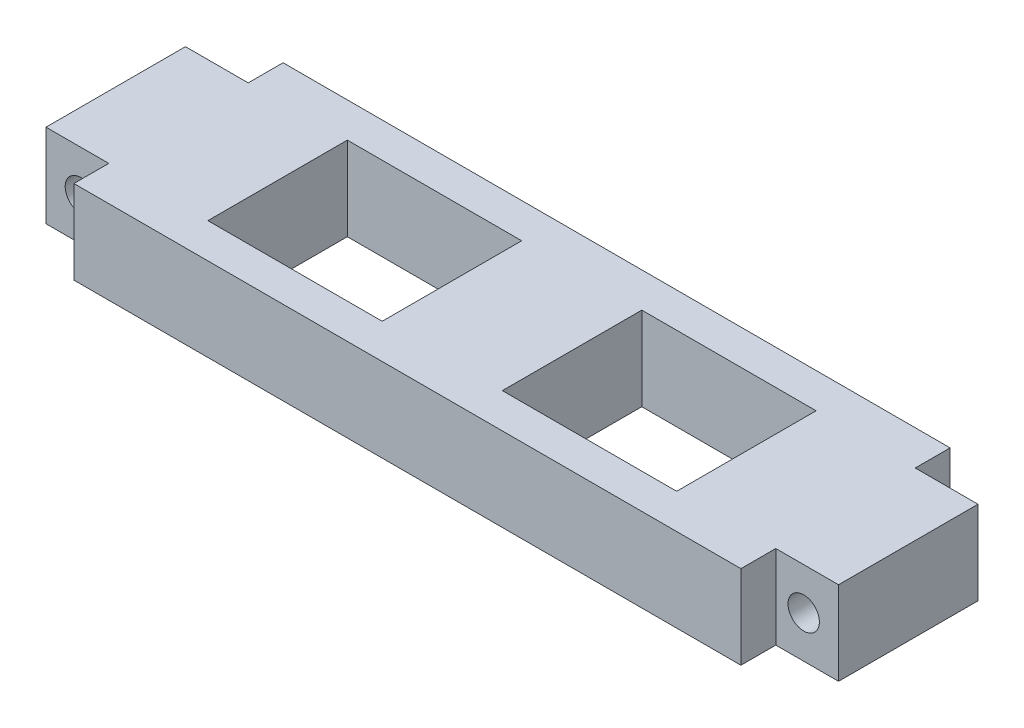
ISO-10303-21;
HEADER;
FILE_DESCRIPTION(('STEP AP214'),'2;1');
FILE_NAME('part.step','',(''),(''),'','','');
FILE_SCHEMA(('AUTOMOTIVE_DESIGN { 1 0 10303 214 1 1 1 1 }'));
ENDSEC;
DATA;
#1=APPLICATION_CONTEXT('core data for automotive mechanical design processes');
#2=APPLICATION_PROTOCOL_DEFINITION('international standard','automotive_design',2000,#1);
#3=PRODUCT_CONTEXT('',#1,'mechanical');
#4=PRODUCT('Part','Part','',(#3));
#5=PRODUCT_RELATED_PRODUCT_CATEGORY('part','',(#4));
#6=PRODUCT_DEFINITION_FORMATION('','',#4);
#7=PRODUCT_DEFINITION_CONTEXT('part definition',#1,'design');
#8=PRODUCT_DEFINITION('design','',#6,#7);
#9=PRODUCT_DEFINITION_SHAPE('','',#8);
#10=(LENGTH_UNIT() NAMED_UNIT(*) SI_UNIT(.MILLI.,.METRE.));
#11=(NAMED_UNIT(*) PLANE_ANGLE_UNIT() SI_UNIT($,.RADIAN.));
#12=(NAMED_UNIT(*) SI_UNIT($,.STERADIAN.) SOLID_ANGLE_UNIT());
#13=UNCERTAINTY_MEASURE_WITH_UNIT(LENGTH_MEASURE(1.E-05),#10,'distance_accuracy_value','');
#14=(GEOMETRIC_REPRESENTATION_CONTEXT(3) GLOBAL_UNCERTAINTY_ASSIGNED_CONTEXT((#13)) GLOBAL_UNIT_ASSIGNED_CONTEXT((#10,
#11,#12)) REPRESENTATION_CONTEXT('',''));
#15=CARTESIAN_POINT('',(0.,0.,0.));
#16=DIRECTION('',(0.,0.,1.));
#17=DIRECTION('',(1.,0.,0.));
#18=AXIS2_PLACEMENT_3D('',#15,#16,#17);
#19=CARTESIAN_POINT('',(0.,12.,0.));
#20=DIRECTION('',(0.,1.,0.));
#21=DIRECTION('',(0.,0.,1.));
#22=AXIS2_PLACEMENT_3D('',#19,#20,#21);
#23=PLANE('',#22);
#24=DIRECTION('',(0.,0.,-1.));
#25=VECTOR('',#24,1.);
#26=CARTESIAN_POINT('',(47.833335,12.,-15.));
#27=LINE('',#26,#25);
#28=CARTESIAN_POINT('',(47.833335,12.,-10.));
#29=VERTEX_POINT('',#28);
#30=CARTESIAN_POINT('',(47.833335,12.,-15.));
#31=VERTEX_POINT('',#30);
#32=EDGE_CURVE('E239',#29,#31,#27,.T.);
#33=ORIENTED_EDGE('',*,*,#32,.T.);
#34=DIRECTION('',(-1.,0.,0.));
#35=VECTOR('',#34,1.);
#36=CARTESIAN_POINT('',(-47.833335,12.,-15.));
#37=LINE('',#36,#35);
#38=CARTESIAN_POINT('',(-47.833335,12.,-15.));
#39=VERTEX_POINT('',#38);
#40=EDGE_CURVE('E242',#31,#39,#37,.T.);
#41=ORIENTED_EDGE('',*,*,#40,.T.);
#42=DIRECTION('',(0.,0.,1.));
#43=VECTOR('',#42,1.);
#44=CARTESIAN_POINT('',(-47.833335,12.,-15.));
#45=LINE('',#44,#43);
#46=CARTESIAN_POINT('',(-47.833335,12.,-10.));
#47=VERTEX_POINT('',#46);
#48=EDGE_CURVE('E245',#39,#47,#45,.T.);
#49=ORIENTED_EDGE('',*,*,#48,.T.);
#50=DIRECTION('',(-1.,0.,0.));
#51=VECTOR('',#50,1.);
#52=CARTESIAN_POINT('',(-47.833335,12.,-10.));
#53=LINE('',#52,#51);
#54=CARTESIAN_POINT('',(-56.833335,12.,-10.));
#55=VERTEX_POINT('',#54);
#56=EDGE_CURVE('E247',#47,#55,#53,.T.);
#57=ORIENTED_EDGE('',*,*,#56,.T.);
#58=DIRECTION('',(0.,0.,1.));
#59=VECTOR('',#58,1.);
#60=CARTESIAN_POINT('',(-56.833335,12.,-10.));
#61=LINE('',#60,#59);
#62=CARTESIAN_POINT('',(-56.833335,12.,10.));
#63=VERTEX_POINT('',#62);
#64=EDGE_CURVE('E249',#55,#63,#61,.T.);
#65=ORIENTED_EDGE('',*,*,#64,.T.);
#66=DIRECTION('',(1.,0.,0.));
#67=VECTOR('',#66,1.);
#68=CARTESIAN_POINT('',(-56.833335,12.,10.));
#69=LINE('',#68,#67);
#70=CARTESIAN_POINT('',(-47.833335,12.,10.));
#71=VERTEX_POINT('',#70);
#72=EDGE_CURVE('E251',#63,#71,#69,.T.);
#73=ORIENTED_EDGE('',*,*,#72,.T.);
#74=DIRECTION('',(0.,0.,1.));
#75=VECTOR('',#74,1.);
#76=CARTESIAN_POINT('',(-47.833335,12.,10.));
#77=LINE('',#76,#75);
#78=CARTESIAN_POINT('',(-47.833335,12.,15.));
#79=VERTEX_POINT('',#78);
#80=EDGE_CURVE('E253',#71,#79,#77,.T.);
#81=ORIENTED_EDGE('',*,*,#80,.T.);
#82=DIRECTION('',(1.,0.,0.));
#83=VECTOR('',#82,1.);
#84=CARTESIAN_POINT('',(-47.833335,12.,15.));
#85=LINE('',#84,#83);
#86=CARTESIAN_POINT('',(47.833335,12.,15.));
#87=VERTEX_POINT('',#86);
#88=EDGE_CURVE('E255',#79,#87,#85,.T.);
#89=ORIENTED_EDGE('',*,*,#88,.T.);
#90=DIRECTION('',(0.,0.,-1.));
#91=VECTOR('',#90,1.);
#92=CARTESIAN_POINT('',(47.833335,12.,10.));
#93=LINE('',#92,#91);
#94=CARTESIAN_POINT('',(47.833335,12.,10.));
#95=VERTEX_POINT('',#94);
#96=EDGE_CURVE('E257',#87,#95,#93,.T.);
#97=ORIENTED_EDGE('',*,*,#96,.T.);
#98=DIRECTION('',(1.,0.,0.));
#99=VECTOR('',#98,1.);
#100=CARTESIAN_POINT('',(56.833335,12.,10.));
#101=LINE('',#100,#99);
#102=CARTESIAN_POINT('',(56.833335,12.,10.));
#103=VERTEX_POINT('',#102);
#104=EDGE_CURVE('E259',#95,#103,#101,.T.);
#105=ORIENTED_EDGE('',*,*,#104,.T.);
#106=DIRECTION('',(0.,0.,-1.));
#107=VECTOR('',#106,1.);
#108=CARTESIAN_POINT('',(56.833335,12.,-10.));
#109=LINE('',#108,#107);
#110=CARTESIAN_POINT('',(56.833335,12.,-10.));
#111=VERTEX_POINT('',#110);
#112=EDGE_CURVE('E261',#103,#111,#109,.T.);
#113=ORIENTED_EDGE('',*,*,#112,.T.);
#114=DIRECTION('',(-1.,0.,0.));
#115=VECTOR('',#114,1.);
#116=CARTESIAN_POINT('',(47.833335,12.,-10.));
#117=LINE('',#116,#115);
#118=EDGE_CURVE('E263',#111,#29,#117,.T.);
#119=ORIENTED_EDGE('',*,*,#118,.T.);
#120=EDGE_LOOP('',(#33,#41,#49,#57,#65,#73,#81,#89,#97,#105,#113,#119));
#121=FACE_BOUND('',#120,.T.);
#122=DIRECTION('',(1.,0.,0.));
#123=VECTOR('',#122,1.);
#124=CARTESIAN_POINT('',(-33.6152893126254,12.,10.));
#125=LINE('',#124,#123);
#126=CARTESIAN_POINT('',(-33.6152893126254,12.,10.));
#127=VERTEX_POINT('',#126);
#128=CARTESIAN_POINT('',(-8.61528931262541,12.,10.));
#129=VERTEX_POINT('',#128);
#130=EDGE_CURVE('E210',#127,#129,#125,.T.);
#131=ORIENTED_EDGE('',*,*,#130,.F.);
#132=DIRECTION('',(0.,0.,1.));
#133=VECTOR('',#132,1.);
#134=CARTESIAN_POINT('',(-33.6152893126254,12.,-10.));
#135=LINE('',#134,#133);
#136=CARTESIAN_POINT('',(-33.6152893126254,12.,-10.));
#137=VERTEX_POINT('',#136);
#138=EDGE_CURVE('E208',#137,#127,#135,.T.);
#139=ORIENTED_EDGE('',*,*,#138,.F.);
#140=DIRECTION('',(-1.,0.,0.));
#141=VECTOR('',#140,1.);
#142=CARTESIAN_POINT('',(-33.6152893126254,12.,-10.));
#143=LINE('',#142,#141);
#144=CARTESIAN_POINT('',(-8.61528931262541,12.,-10.));
#145=VERTEX_POINT('',#144);
#146=EDGE_CURVE('E216',#145,#137,#143,.T.);
#147=ORIENTED_EDGE('',*,*,#146,.F.);
#148=DIRECTION('',(0.,0.,-1.));
#149=VECTOR('',#148,1.);
#150=CARTESIAN_POINT('',(-8.61528931262541,12.,-10.));
#151=LINE('',#150,#149);
#152=EDGE_CURVE('E213',#129,#145,#151,.T.);
#153=ORIENTED_EDGE('',*,*,#152,.F.);
#154=EDGE_LOOP('',(#131,#139,#147,#153));
#155=FACE_BOUND('',#154,.T.);
#156=DIRECTION('',(1.,0.,0.));
#157=VECTOR('',#156,1.);
#158=CARTESIAN_POINT('',(8.61528931262542,12.,10.));
#159=LINE('',#158,#157);
#160=CARTESIAN_POINT('',(8.61528931262542,12.,10.));
#161=VERTEX_POINT('',#160);
#162=CARTESIAN_POINT('',(33.6152893126254,12.,10.));
#163=VERTEX_POINT('',#162);
#164=EDGE_CURVE('E179',#161,#163,#159,.T.);
#165=ORIENTED_EDGE('',*,*,#164,.F.);
#166=DIRECTION('',(0.,0.,1.));
#167=VECTOR('',#166,1.);
#168=CARTESIAN_POINT('',(8.61528931262542,12.,-10.));
#169=LINE('',#168,#167);
#170=CARTESIAN_POINT('',(8.61528931262542,12.,-10.));
#171=VERTEX_POINT('',#170);
#172=EDGE_CURVE('E171',#171,#161,#169,.T.);
#173=ORIENTED_EDGE('',*,*,#172,.F.);
#174=DIRECTION('',(-1.,0.,0.));
#175=VECTOR('',#174,1.);
#176=CARTESIAN_POINT('',(8.61528931262542,12.,-10.));
#177=LINE('',#176,#175);
#178=CARTESIAN_POINT('',(33.6152893126254,12.,-10.));
#179=VERTEX_POINT('',#178);
#180=EDGE_CURVE('E193',#179,#171,#177,.T.);
#181=ORIENTED_EDGE('',*,*,#180,.F.);
#182=DIRECTION('',(0.,0.,-1.));
#183=VECTOR('',#182,1.);
#184=CARTESIAN_POINT('',(33.6152893126254,12.,-10.));
#185=LINE('',#184,#183);
#186=EDGE_CURVE('E191',#163,#179,#185,.T.);
#187=ORIENTED_EDGE('',*,*,#186,.F.);
#188=EDGE_LOOP('',(#165,#173,#181,#187));
#189=FACE_BOUND('',#188,.T.);
#190=ADVANCED_FACE('F33',(#121,#155,#189),#23,.T.);
#191=CARTESIAN_POINT('',(0.,0.,0.));
#192=DIRECTION('',(0.,1.,0.));
#193=DIRECTION('',(0.,0.,1.));
#194=AXIS2_PLACEMENT_3D('',#191,#192,#193);
#195=PLANE('',#194);
#196=DIRECTION('',(0.,0.,1.));
#197=VECTOR('',#196,1.);
#198=CARTESIAN_POINT('',(-33.6152893126254,0.,-10.));
#199=LINE('',#198,#197);
#200=CARTESIAN_POINT('',(-33.6152893126254,0.,-10.));
#201=VERTEX_POINT('',#200);
#202=CARTESIAN_POINT('',(-33.6152893126254,0.,10.));
#203=VERTEX_POINT('',#202);
#204=EDGE_CURVE('E187',#201,#203,#199,.T.);
#205=ORIENTED_EDGE('',*,*,#204,.T.);
#206=DIRECTION('',(1.,0.,0.));
#207=VECTOR('',#206,1.);
#208=CARTESIAN_POINT('',(-33.6152893126254,0.,10.));
#209=LINE('',#208,#207);
#210=CARTESIAN_POINT('',(-8.61528931262541,0.,10.));
#211=VERTEX_POINT('',#210);
#212=EDGE_CURVE('E221',#203,#211,#209,.T.);
#213=ORIENTED_EDGE('',*,*,#212,.T.);
#214=DIRECTION('',(0.,0.,-1.));
#215=VECTOR('',#214,1.);
#216=CARTESIAN_POINT('',(-8.61528931262541,0.,-10.));
#217=LINE('',#216,#215);
#218=CARTESIAN_POINT('',(-8.61528931262541,0.,-10.));
#219=VERTEX_POINT('',#218);
#220=EDGE_CURVE('E224',#211,#219,#217,.T.);
#221=ORIENTED_EDGE('',*,*,#220,.T.);
#222=DIRECTION('',(-1.,0.,0.));
#223=VECTOR('',#222,1.);
#224=CARTESIAN_POINT('',(-33.6152893126254,0.,-10.));
#225=LINE('',#224,#223);
#226=EDGE_CURVE('E211',#219,#201,#225,.T.);
#227=ORIENTED_EDGE('',*,*,#226,.T.);
#228=EDGE_LOOP('',(#205,#213,#221,#227));
#229=FACE_BOUND('',#228,.T.);
#230=DIRECTION('',(0.,0.,-1.));
#231=VECTOR('',#230,1.);
#232=CARTESIAN_POINT('',(47.833335,0.,-15.));
#233=LINE('',#232,#231);
#234=CARTESIAN_POINT('',(47.833335,0.,-10.));
#235=VERTEX_POINT('',#234);
#236=CARTESIAN_POINT('',(47.833335,0.,-15.));
#237=VERTEX_POINT('',#236);
#238=EDGE_CURVE('E238',#235,#237,#233,.T.);
#239=ORIENTED_EDGE('',*,*,#238,.F.);
#240=DIRECTION('',(-1.,0.,0.));
#241=VECTOR('',#240,1.);
#242=CARTESIAN_POINT('',(47.833335,0.,-10.));
#243=LINE('',#242,#241);
#244=CARTESIAN_POINT('',(56.833335,0.,-10.));
#245=VERTEX_POINT('',#244);
#246=EDGE_CURVE('E243',#245,#235,#243,.T.);
#247=ORIENTED_EDGE('',*,*,#246,.F.);
#248=DIRECTION('',(0.,0.,-1.));
#249=VECTOR('',#248,1.);
#250=CARTESIAN_POINT('',(56.833335,0.,-10.));
#251=LINE('',#250,#249);
#252=CARTESIAN_POINT('',(56.833335,0.,10.));
#253=VERTEX_POINT('',#252);
#254=EDGE_CURVE('E286',#253,#245,#251,.T.);
#255=ORIENTED_EDGE('',*,*,#254,.F.);
#256=DIRECTION('',(1.,0.,0.));
#257=VECTOR('',#256,1.);
#258=CARTESIAN_POINT('',(56.833335,0.,10.));
#259=LINE('',#258,#257);
#260=CARTESIAN_POINT('',(47.833335,0.,10.));
#261=VERTEX_POINT('',#260);
#262=EDGE_CURVE('E284',#261,#253,#259,.T.);
#263=ORIENTED_EDGE('',*,*,#262,.F.);
#264=DIRECTION('',(0.,0.,-1.));
#265=VECTOR('',#264,1.);
#266=CARTESIAN_POINT('',(47.833335,0.,10.));
#267=LINE('',#266,#265);
#268=CARTESIAN_POINT('',(47.833335,0.,15.));
#269=VERTEX_POINT('',#268);
#270=EDGE_CURVE('E282',#269,#261,#267,.T.);
#271=ORIENTED_EDGE('',*,*,#270,.F.);
#272=DIRECTION('',(1.,0.,0.));
#273=VECTOR('',#272,1.);
#274=CARTESIAN_POINT('',(-47.833335,0.,15.));
#275=LINE('',#274,#273);
#276=CARTESIAN_POINT('',(-47.833335,0.,15.));
#277=VERTEX_POINT('',#276);
#278=EDGE_CURVE('E280',#277,#269,#275,.T.);
#279=ORIENTED_EDGE('',*,*,#278,.F.);
#280=DIRECTION('',(0.,0.,1.));
#281=VECTOR('',#280,1.);
#282=CARTESIAN_POINT('',(-47.833335,0.,10.));
#283=LINE('',#282,#281);
#284=CARTESIAN_POINT('',(-47.833335,0.,10.));
#285=VERTEX_POINT('',#284);
#286=EDGE_CURVE('E278',#285,#277,#283,.T.);
#287=ORIENTED_EDGE('',*,*,#286,.F.);
#288=DIRECTION('',(1.,0.,0.));
#289=VECTOR('',#288,1.);
#290=CARTESIAN_POINT('',(-56.833335,0.,10.));
#291=LINE('',#290,#289);
#292=CARTESIAN_POINT('',(-56.833335,0.,10.));
#293=VERTEX_POINT('',#292);
#294=EDGE_CURVE('E276',#293,#285,#291,.T.);
#295=ORIENTED_EDGE('',*,*,#294,.F.);
#296=DIRECTION('',(0.,0.,1.));
#297=VECTOR('',#296,1.);
#298=CARTESIAN_POINT('',(-56.833335,0.,-10.));
#299=LINE('',#298,#297);
#300=CARTESIAN_POINT('',(-56.833335,0.,-10.));
#301=VERTEX_POINT('',#300);
#302=EDGE_CURVE('E274',#301,#293,#299,.T.);
#303=ORIENTED_EDGE('',*,*,#302,.F.);
#304=DIRECTION('',(-1.,0.,0.));
#305=VECTOR('',#304,1.);
#306=CARTESIAN_POINT('',(-47.833335,0.,-10.));
#307=LINE('',#306,#305);
#308=CARTESIAN_POINT('',(-47.833335,0.,-10.));
#309=VERTEX_POINT('',#308);
#310=EDGE_CURVE('E272',#309,#301,#307,.T.);
#311=ORIENTED_EDGE('',*,*,#310,.F.);
#312=DIRECTION('',(0.,0.,1.));
#313=VECTOR('',#312,1.);
#314=CARTESIAN_POINT('',(-47.833335,0.,-15.));
#315=LINE('',#314,#313);
#316=CARTESIAN_POINT('',(-47.833335,0.,-15.));
#317=VERTEX_POINT('',#316);
#318=EDGE_CURVE('E270',#317,#309,#315,.T.);
#319=ORIENTED_EDGE('',*,*,#318,.F.);
#320=DIRECTION('',(-1.,0.,0.));
#321=VECTOR('',#320,1.);
#322=CARTESIAN_POINT('',(-47.833335,0.,-15.));
#323=LINE('',#322,#321);
#324=EDGE_CURVE('E268',#237,#317,#323,.T.);
#325=ORIENTED_EDGE('',*,*,#324,.F.);
#326=EDGE_LOOP('',(#239,#247,#255,#263,#271,#279,#287,#295,#303,#311,#319,#325));
#327=FACE_BOUND('',#326,.T.);
#328=DIRECTION('',(0.,0.,1.));
#329=VECTOR('',#328,1.);
#330=CARTESIAN_POINT('',(8.61528931262542,0.,-10.));
#331=LINE('',#330,#329);
#332=CARTESIAN_POINT('',(8.61528931262542,0.,-10.));
#333=VERTEX_POINT('',#332);
#334=CARTESIAN_POINT('',(8.61528931262542,0.,10.));
#335=VERTEX_POINT('',#334);
#336=EDGE_CURVE('E57',#333,#335,#331,.T.);
#337=ORIENTED_EDGE('',*,*,#336,.T.);
#338=DIRECTION('',(1.,0.,0.));
#339=VECTOR('',#338,1.);
#340=CARTESIAN_POINT('',(8.61528931262542,0.,10.));
#341=LINE('',#340,#339);
#342=CARTESIAN_POINT('',(33.6152893126254,0.,10.));
#343=VERTEX_POINT('',#342);
#344=EDGE_CURVE('E186',#335,#343,#341,.T.);
#345=ORIENTED_EDGE('',*,*,#344,.T.);
#346=DIRECTION('',(0.,0.,-1.));
#347=VECTOR('',#346,1.);
#348=CARTESIAN_POINT('',(33.6152893126254,0.,-10.));
#349=LINE('',#348,#347);
#350=CARTESIAN_POINT('',(33.6152893126254,0.,-10.));
#351=VERTEX_POINT('',#350);
#352=EDGE_CURVE('E200',#343,#351,#349,.T.);
#353=ORIENTED_EDGE('',*,*,#352,.T.);
#354=DIRECTION('',(-1.,0.,0.));
#355=VECTOR('',#354,1.);
#356=CARTESIAN_POINT('',(8.61528931262542,0.,-10.));
#357=LINE('',#356,#355);
#358=EDGE_CURVE('E180',#351,#333,#357,.T.);
#359=ORIENTED_EDGE('',*,*,#358,.T.);
#360=EDGE_LOOP('',(#337,#345,#353,#359));
#361=FACE_BOUND('',#360,.T.);
#362=ADVANCED_FACE('F329',(#229,#327,#361),#195,.F.);
#363=CARTESIAN_POINT('',(47.833335,12.,-15.));
#364=DIRECTION('',(-1.,0.,0.));
#365=DIRECTION('',(0.,0.,1.));
#366=AXIS2_PLACEMENT_3D('',#363,#364,#365);
#367=PLANE('',#366);
#368=ORIENTED_EDGE('',*,*,#238,.T.);
#369=DIRECTION('',(0.,-1.,0.));
#370=VECTOR('',#369,1.);
#371=CARTESIAN_POINT('',(47.833335,12.,-15.));
#372=LINE('',#371,#370);
#373=EDGE_CURVE('E11',#31,#237,#372,.T.);
#374=ORIENTED_EDGE('',*,*,#373,.F.);
#375=ORIENTED_EDGE('',*,*,#32,.F.);
#376=DIRECTION('',(0.,-1.,0.));
#377=VECTOR('',#376,1.);
#378=CARTESIAN_POINT('',(47.833335,12.,-10.));
#379=LINE('',#378,#377);
#380=EDGE_CURVE('E265',#29,#235,#379,.T.);
#381=ORIENTED_EDGE('',*,*,#380,.T.);
#382=EDGE_LOOP('',(#368,#374,#375,#381));
#383=FACE_BOUND('',#382,.T.);
#384=ADVANCED_FACE('F35',(#383),#367,.F.);
#385=CARTESIAN_POINT('',(-47.833335,12.,-15.));
#386=DIRECTION('',(0.,0.,1.));
#387=DIRECTION('',(1.,0.,0.));
#388=AXIS2_PLACEMENT_3D('',#385,#386,#387);
#389=PLANE('',#388);
#390=ORIENTED_EDGE('',*,*,#324,.T.);
#391=DIRECTION('',(0.,-1.,0.));
#392=VECTOR('',#391,1.);
#393=CARTESIAN_POINT('',(-47.833335,12.,-15.));
#394=LINE('',#393,#392);
#395=EDGE_CURVE('E42',#39,#317,#394,.T.);
#396=ORIENTED_EDGE('',*,*,#395,.F.);
#397=ORIENTED_EDGE('',*,*,#40,.F.);
#398=ORIENTED_EDGE('',*,*,#373,.T.);
#399=EDGE_LOOP('',(#390,#396,#397,#398));
#400=FACE_BOUND('',#399,.T.);
#401=ADVANCED_FACE('F347',(#400),#389,.F.);
#402=CARTESIAN_POINT('',(-47.833335,12.,-15.));
#403=DIRECTION('',(1.,0.,0.));
#404=DIRECTION('',(0.,0.,-1.));
#405=AXIS2_PLACEMENT_3D('',#402,#403,#404);
#406=PLANE('',#405);
#407=ORIENTED_EDGE('',*,*,#318,.T.);
#408=DIRECTION('',(0.,-1.,0.));
#409=VECTOR('',#408,1.);
#410=CARTESIAN_POINT('',(-47.833335,12.,-10.));
#411=LINE('',#410,#409);
#412=EDGE_CURVE('E315',#47,#309,#411,.T.);
#413=ORIENTED_EDGE('',*,*,#412,.F.);
#414=ORIENTED_EDGE('',*,*,#48,.F.);
#415=ORIENTED_EDGE('',*,*,#395,.T.);
#416=EDGE_LOOP('',(#407,#413,#414,#415));
#417=FACE_BOUND('',#416,.T.);
#418=ADVANCED_FACE('F323',(#417),#406,.F.);
#419=CARTESIAN_POINT('',(-47.833335,12.,-10.));
#420=DIRECTION('',(0.,0.,1.));
#421=DIRECTION('',(1.,0.,0.));
#422=AXIS2_PLACEMENT_3D('',#419,#420,#421);
#423=PLANE('',#422);
#424=CARTESIAN_POINT('',(-51.833335,6.,-9.99999999999999));
#425=DIRECTION('',(0.,0.,-1.));
#426=DIRECTION('',(1.,0.,0.));
#427=AXIS2_PLACEMENT_3D('',#424,#425,#426);
#428=CIRCLE('',#427,2.25);
#429=CARTESIAN_POINT('',(-49.583335,6.,-9.99999999999999));
#430=VERTEX_POINT('',#429);
#431=EDGE_CURVE('E594',#430,#430,#428,.T.);
#432=ORIENTED_EDGE('',*,*,#431,.F.);
#433=EDGE_LOOP('',(#432));
#434=FACE_BOUND('',#433,.T.);
#435=ORIENTED_EDGE('',*,*,#310,.T.);
#436=DIRECTION('',(0.,-1.,0.));
#437=VECTOR('',#436,1.);
#438=CARTESIAN_POINT('',(-56.833335,12.,-10.));
#439=LINE('',#438,#437);
#440=EDGE_CURVE('E312',#55,#301,#439,.T.);
#441=ORIENTED_EDGE('',*,*,#440,.F.);
#442=ORIENTED_EDGE('',*,*,#56,.F.);
#443=ORIENTED_EDGE('',*,*,#412,.T.);
#444=EDGE_LOOP('',(#435,#441,#442,#443));
#445=FACE_BOUND('',#444,.T.);
#446=ADVANCED_FACE('F335',(#434,#445),#423,.F.);
#447=CARTESIAN_POINT('',(-56.833335,12.,-10.));
#448=DIRECTION('',(1.,0.,0.));
#449=DIRECTION('',(0.,0.,-1.));
#450=AXIS2_PLACEMENT_3D('',#447,#448,#449);
#451=PLANE('',#450);
#452=ORIENTED_EDGE('',*,*,#302,.T.);
#453=DIRECTION('',(0.,-1.,0.));
#454=VECTOR('',#453,1.);
#455=CARTESIAN_POINT('',(-56.833335,12.,10.));
#456=LINE('',#455,#454);
#457=EDGE_CURVE('E309',#63,#293,#456,.T.);
#458=ORIENTED_EDGE('',*,*,#457,.F.);
#459=ORIENTED_EDGE('',*,*,#64,.F.);
#460=ORIENTED_EDGE('',*,*,#440,.T.);
#461=EDGE_LOOP('',(#452,#458,#459,#460));
#462=FACE_BOUND('',#461,.T.);
#463=ADVANCED_FACE('F339',(#462),#451,.F.);
#464=CARTESIAN_POINT('',(-56.833335,12.,10.));
#465=DIRECTION('',(0.,0.,-1.));
#466=DIRECTION('',(-1.,0.,0.));
#467=AXIS2_PLACEMENT_3D('',#464,#465,#466);
#468=PLANE('',#467);
#469=CARTESIAN_POINT('',(-51.833335,6.,10.));
#470=DIRECTION('',(0.,0.,-1.));
#471=DIRECTION('',(-1.,0.,0.));
#472=AXIS2_PLACEMENT_3D('',#469,#470,#471);
#473=CIRCLE('',#472,2.25);
#474=CARTESIAN_POINT('',(-54.083335,6.,10.));
#475=VERTEX_POINT('',#474);
#476=EDGE_CURVE('E37',#475,#475,#473,.T.);
#477=ORIENTED_EDGE('',*,*,#476,.T.);
#478=EDGE_LOOP('',(#477));
#479=FACE_BOUND('',#478,.T.);
#480=ORIENTED_EDGE('',*,*,#294,.T.);
#481=DIRECTION('',(0.,-1.,0.));
#482=VECTOR('',#481,1.);
#483=CARTESIAN_POINT('',(-47.833335,12.,10.));
#484=LINE('',#483,#482);
#485=EDGE_CURVE('E306',#71,#285,#484,.T.);
#486=ORIENTED_EDGE('',*,*,#485,.F.);
#487=ORIENTED_EDGE('',*,*,#72,.F.);
#488=ORIENTED_EDGE('',*,*,#457,.T.);
#489=EDGE_LOOP('',(#480,#486,#487,#488));
#490=FACE_BOUND('',#489,.T.);
#491=ADVANCED_FACE('F380',(#479,#490),#468,.F.);
#492=CARTESIAN_POINT('',(-47.833335,12.,10.));
#493=DIRECTION('',(1.,0.,0.));
#494=DIRECTION('',(0.,0.,-1.));
#495=AXIS2_PLACEMENT_3D('',#492,#493,#494);
#496=PLANE('',#495);
#497=ORIENTED_EDGE('',*,*,#286,.T.);
#498=DIRECTION('',(0.,-1.,0.));
#499=VECTOR('',#498,1.);
#500=CARTESIAN_POINT('',(-47.833335,12.,15.));
#501=LINE('',#500,#499);
#502=EDGE_CURVE('E303',#79,#277,#501,.T.);
#503=ORIENTED_EDGE('',*,*,#502,.F.);
#504=ORIENTED_EDGE('',*,*,#80,.F.);
#505=ORIENTED_EDGE('',*,*,#485,.T.);
#506=EDGE_LOOP('',(#497,#503,#504,#505));
#507=FACE_BOUND('',#506,.T.);
#508=ADVANCED_FACE('F378',(#507),#496,.F.);
#509=CARTESIAN_POINT('',(-47.833335,12.,15.));
#510=DIRECTION('',(0.,0.,-1.));
#511=DIRECTION('',(-1.,0.,0.));
#512=AXIS2_PLACEMENT_3D('',#509,#510,#511);
#513=PLANE('',#512);
#514=ORIENTED_EDGE('',*,*,#278,.T.);
#515=DIRECTION('',(0.,-1.,0.));
#516=VECTOR('',#515,1.);
#517=CARTESIAN_POINT('',(47.833335,12.,15.));
#518=LINE('',#517,#516);
#519=EDGE_CURVE('E300',#87,#269,#518,.T.);
#520=ORIENTED_EDGE('',*,*,#519,.F.);
#521=ORIENTED_EDGE('',*,*,#88,.F.);
#522=ORIENTED_EDGE('',*,*,#502,.T.);
#523=EDGE_LOOP('',(#514,#520,#521,#522));
#524=FACE_BOUND('',#523,.T.);
#525=ADVANCED_FACE('F374',(#524),#513,.F.);
#526=CARTESIAN_POINT('',(47.833335,12.,10.));
#527=DIRECTION('',(-1.,0.,0.));
#528=DIRECTION('',(0.,0.,1.));
#529=AXIS2_PLACEMENT_3D('',#526,#527,#528);
#530=PLANE('',#529);
#531=ORIENTED_EDGE('',*,*,#270,.T.);
#532=DIRECTION('',(0.,-1.,0.));
#533=VECTOR('',#532,1.);
#534=CARTESIAN_POINT('',(47.833335,12.,10.));
#535=LINE('',#534,#533);
#536=EDGE_CURVE('E297',#95,#261,#535,.T.);
#537=ORIENTED_EDGE('',*,*,#536,.F.);
#538=ORIENTED_EDGE('',*,*,#96,.F.);
#539=ORIENTED_EDGE('',*,*,#519,.T.);
#540=EDGE_LOOP('',(#531,#537,#538,#539));
#541=FACE_BOUND('',#540,.T.);
#542=ADVANCED_FACE('F369',(#541),#530,.F.);
#543=CARTESIAN_POINT('',(56.833335,12.,10.));
#544=DIRECTION('',(0.,0.,-1.));
#545=DIRECTION('',(-1.,0.,0.));
#546=AXIS2_PLACEMENT_3D('',#543,#544,#545);
#547=PLANE('',#546);
#548=CARTESIAN_POINT('',(51.833335,6.,10.));
#549=DIRECTION('',(0.,0.,-1.));
#550=DIRECTION('',(-1.,0.,0.));
#551=AXIS2_PLACEMENT_3D('',#548,#549,#550);
#552=CIRCLE('',#551,2.25);
#553=CARTESIAN_POINT('',(49.583335,6.,10.));
#554=VERTEX_POINT('',#553);
#555=EDGE_CURVE('E598',#554,#554,#552,.T.);
#556=ORIENTED_EDGE('',*,*,#555,.T.);
#557=EDGE_LOOP('',(#556));
#558=FACE_BOUND('',#557,.T.);
#559=ORIENTED_EDGE('',*,*,#262,.T.);
#560=DIRECTION('',(0.,-1.,0.));
#561=VECTOR('',#560,1.);
#562=CARTESIAN_POINT('',(56.833335,12.,10.));
#563=LINE('',#562,#561);
#564=EDGE_CURVE('E294',#103,#253,#563,.T.);
#565=ORIENTED_EDGE('',*,*,#564,.F.);
#566=ORIENTED_EDGE('',*,*,#104,.F.);
#567=ORIENTED_EDGE('',*,*,#536,.T.);
#568=EDGE_LOOP('',(#559,#565,#566,#567));
#569=FACE_BOUND('',#568,.T.);
#570=ADVANCED_FACE('F363',(#558,#569),#547,.F.);
#571=CARTESIAN_POINT('',(56.833335,12.,-10.));
#572=DIRECTION('',(-1.,0.,0.));
#573=DIRECTION('',(0.,0.,1.));
#574=AXIS2_PLACEMENT_3D('',#571,#572,#573);
#575=PLANE('',#574);
#576=ORIENTED_EDGE('',*,*,#254,.T.);
#577=DIRECTION('',(0.,-1.,0.));
#578=VECTOR('',#577,1.);
#579=CARTESIAN_POINT('',(56.833335,12.,-10.));
#580=LINE('',#579,#578);
#581=EDGE_CURVE('E291',#111,#245,#580,.T.);
#582=ORIENTED_EDGE('',*,*,#581,.F.);
#583=ORIENTED_EDGE('',*,*,#112,.F.);
#584=ORIENTED_EDGE('',*,*,#564,.T.);
#585=EDGE_LOOP('',(#576,#582,#583,#584));
#586=FACE_BOUND('',#585,.T.);
#587=ADVANCED_FACE('F359',(#586),#575,.F.);
#588=CARTESIAN_POINT('',(47.833335,12.,-10.));
#589=DIRECTION('',(0.,0.,1.));
#590=DIRECTION('',(1.,0.,0.));
#591=AXIS2_PLACEMENT_3D('',#588,#589,#590);
#592=PLANE('',#591);
#593=CARTESIAN_POINT('',(51.833335,6.,-9.99999999999999));
#594=DIRECTION('',(0.,0.,-1.));
#595=DIRECTION('',(-1.,0.,0.));
#596=AXIS2_PLACEMENT_3D('',#593,#594,#595);
#597=CIRCLE('',#596,2.25);
#598=CARTESIAN_POINT('',(49.583335,6.,-9.99999999999999));
#599=VERTEX_POINT('',#598);
#600=EDGE_CURVE('E595',#599,#599,#597,.T.);
#601=ORIENTED_EDGE('',*,*,#600,.F.);
#602=EDGE_LOOP('',(#601));
#603=FACE_BOUND('',#602,.T.);
#604=ORIENTED_EDGE('',*,*,#246,.T.);
#605=ORIENTED_EDGE('',*,*,#380,.F.);
#606=ORIENTED_EDGE('',*,*,#118,.F.);
#607=ORIENTED_EDGE('',*,*,#581,.T.);
#608=EDGE_LOOP('',(#604,#605,#606,#607));
#609=FACE_BOUND('',#608,.T.);
#610=ADVANCED_FACE('F354',(#603,#609),#592,.F.);
#611=CARTESIAN_POINT('',(-33.6152893126254,12.,-10.));
#612=DIRECTION('',(1.,0.,0.));
#613=DIRECTION('',(0.,0.,-1.));
#614=AXIS2_PLACEMENT_3D('',#611,#612,#613);
#615=PLANE('',#614);
#616=ORIENTED_EDGE('',*,*,#204,.F.);
#617=DIRECTION('',(0.,-1.,0.));
#618=VECTOR('',#617,1.);
#619=CARTESIAN_POINT('',(-33.6152893126254,12.,-10.));
#620=LINE('',#619,#618);
#621=EDGE_CURVE('E218',#137,#201,#620,.T.);
#622=ORIENTED_EDGE('',*,*,#621,.F.);
#623=ORIENTED_EDGE('',*,*,#138,.T.);
#624=DIRECTION('',(0.,-1.,0.));
#625=VECTOR('',#624,1.);
#626=CARTESIAN_POINT('',(-33.6152893126254,12.,10.));
#627=LINE('',#626,#625);
#628=EDGE_CURVE('E235',#127,#203,#627,.T.);
#629=ORIENTED_EDGE('',*,*,#628,.T.);
#630=EDGE_LOOP('',(#616,#622,#623,#629));
#631=FACE_BOUND('',#630,.T.);
#632=ADVANCED_FACE('F399',(#631),#615,.T.);
#633=CARTESIAN_POINT('',(-33.6152893126254,12.,10.));
#634=DIRECTION('',(0.,0.,-1.));
#635=DIRECTION('',(-1.,0.,0.));
#636=AXIS2_PLACEMENT_3D('',#633,#634,#635);
#637=PLANE('',#636);
#638=ORIENTED_EDGE('',*,*,#212,.F.);
#639=ORIENTED_EDGE('',*,*,#628,.F.);
#640=ORIENTED_EDGE('',*,*,#130,.T.);
#641=DIRECTION('',(0.,-1.,0.));
#642=VECTOR('',#641,1.);
#643=CARTESIAN_POINT('',(-8.61528931262541,12.,10.));
#644=LINE('',#643,#642);
#645=EDGE_CURVE('E233',#129,#211,#644,.T.);
#646=ORIENTED_EDGE('',*,*,#645,.T.);
#647=EDGE_LOOP('',(#638,#639,#640,#646));
#648=FACE_BOUND('',#647,.T.);
#649=ADVANCED_FACE('F440',(#648),#637,.T.);
#650=CARTESIAN_POINT('',(-8.61528931262541,12.,-10.));
#651=DIRECTION('',(-1.,0.,0.));
#652=DIRECTION('',(0.,0.,1.));
#653=AXIS2_PLACEMENT_3D('',#650,#651,#652);
#654=PLANE('',#653);
#655=ORIENTED_EDGE('',*,*,#220,.F.);
#656=ORIENTED_EDGE('',*,*,#645,.F.);
#657=ORIENTED_EDGE('',*,*,#152,.T.);
#658=DIRECTION('',(0.,-1.,0.));
#659=VECTOR('',#658,1.);
#660=CARTESIAN_POINT('',(-8.61528931262541,12.,-10.));
#661=LINE('',#660,#659);
#662=EDGE_CURVE('E231',#145,#219,#661,.T.);
#663=ORIENTED_EDGE('',*,*,#662,.T.);
#664=EDGE_LOOP('',(#655,#656,#657,#663));
#665=FACE_BOUND('',#664,.T.);
#666=ADVANCED_FACE('F447',(#665),#654,.T.);
#667=CARTESIAN_POINT('',(-33.6152893126254,12.,-10.));
#668=DIRECTION('',(0.,0.,1.));
#669=DIRECTION('',(1.,0.,0.));
#670=AXIS2_PLACEMENT_3D('',#667,#668,#669);
#671=PLANE('',#670);
#672=ORIENTED_EDGE('',*,*,#226,.F.);
#673=ORIENTED_EDGE('',*,*,#662,.F.);
#674=ORIENTED_EDGE('',*,*,#146,.T.);
#675=ORIENTED_EDGE('',*,*,#621,.T.);
#676=EDGE_LOOP('',(#672,#673,#674,#675));
#677=FACE_BOUND('',#676,.T.);
#678=ADVANCED_FACE('F454',(#677),#671,.T.);
#679=CARTESIAN_POINT('',(8.61528931262542,12.,-10.));
#680=DIRECTION('',(1.,0.,0.));
#681=DIRECTION('',(0.,0.,-1.));
#682=AXIS2_PLACEMENT_3D('',#679,#680,#681);
#683=PLANE('',#682);
#684=ORIENTED_EDGE('',*,*,#336,.F.);
#685=DIRECTION('',(0.,-1.,0.));
#686=VECTOR('',#685,1.);
#687=CARTESIAN_POINT('',(8.61528931262542,12.,-10.));
#688=LINE('',#687,#686);
#689=EDGE_CURVE('E175',#171,#333,#688,.T.);
#690=ORIENTED_EDGE('',*,*,#689,.F.);
#691=ORIENTED_EDGE('',*,*,#172,.T.);
#692=DIRECTION('',(0.,-1.,0.));
#693=VECTOR('',#692,1.);
#694=CARTESIAN_POINT('',(8.61528931262542,12.,10.));
#695=LINE('',#694,#693);
#696=EDGE_CURVE('E174',#161,#335,#695,.T.);
#697=ORIENTED_EDGE('',*,*,#696,.T.);
#698=EDGE_LOOP('',(#684,#690,#691,#697));
#699=FACE_BOUND('',#698,.T.);
#700=ADVANCED_FACE('F173',(#699),#683,.T.);
#701=CARTESIAN_POINT('',(8.61528931262542,12.,10.));
#702=DIRECTION('',(0.,0.,-1.));
#703=DIRECTION('',(-1.,0.,0.));
#704=AXIS2_PLACEMENT_3D('',#701,#702,#703);
#705=PLANE('',#704);
#706=ORIENTED_EDGE('',*,*,#344,.F.);
#707=ORIENTED_EDGE('',*,*,#696,.F.);
#708=ORIENTED_EDGE('',*,*,#164,.T.);
#709=DIRECTION('',(0.,-1.,0.));
#710=VECTOR('',#709,1.);
#711=CARTESIAN_POINT('',(33.6152893126254,12.,10.));
#712=LINE('',#711,#710);
#713=EDGE_CURVE('E188',#163,#343,#712,.T.);
#714=ORIENTED_EDGE('',*,*,#713,.T.);
#715=EDGE_LOOP('',(#706,#707,#708,#714));
#716=FACE_BOUND('',#715,.T.);
#717=ADVANCED_FACE('F183',(#716),#705,.T.);
#718=CARTESIAN_POINT('',(33.6152893126254,12.,-10.));
#719=DIRECTION('',(-1.,0.,0.));
#720=DIRECTION('',(0.,0.,1.));
#721=AXIS2_PLACEMENT_3D('',#718,#719,#720);
#722=PLANE('',#721);
#723=ORIENTED_EDGE('',*,*,#352,.F.);
#724=ORIENTED_EDGE('',*,*,#713,.F.);
#725=ORIENTED_EDGE('',*,*,#186,.T.);
#726=DIRECTION('',(0.,-1.,0.));
#727=VECTOR('',#726,1.);
#728=CARTESIAN_POINT('',(33.6152893126254,12.,-10.));
#729=LINE('',#728,#727);
#730=EDGE_CURVE('E49',#179,#351,#729,.T.);
#731=ORIENTED_EDGE('',*,*,#730,.T.);
#732=EDGE_LOOP('',(#723,#724,#725,#731));
#733=FACE_BOUND('',#732,.T.);
#734=ADVANCED_FACE('F475',(#733),#722,.T.);
#735=CARTESIAN_POINT('',(8.61528931262542,12.,-10.));
#736=DIRECTION('',(0.,0.,1.));
#737=DIRECTION('',(1.,0.,0.));
#738=AXIS2_PLACEMENT_3D('',#735,#736,#737);
#739=PLANE('',#738);
#740=ORIENTED_EDGE('',*,*,#358,.F.);
#741=ORIENTED_EDGE('',*,*,#730,.F.);
#742=ORIENTED_EDGE('',*,*,#180,.T.);
#743=ORIENTED_EDGE('',*,*,#689,.T.);
#744=EDGE_LOOP('',(#740,#741,#742,#743));
#745=FACE_BOUND('',#744,.T.);
#746=ADVANCED_FACE('F482',(#745),#739,.T.);
#747=CARTESIAN_POINT('',(51.833335,6.,15.));
#748=DIRECTION('',(0.,0.,-1.));
#749=DIRECTION('',(-1.,0.,0.));
#750=AXIS2_PLACEMENT_3D('',#747,#748,#749);
#751=CYLINDRICAL_SURFACE('',#750,2.25);
#752=ORIENTED_EDGE('',*,*,#600,.T.);
#753=EDGE_LOOP('',(#752));
#754=FACE_BOUND('',#753,.T.);
#755=ORIENTED_EDGE('',*,*,#555,.F.);
#756=EDGE_LOOP('',(#755));
#757=FACE_BOUND('',#756,.T.);
#758=ADVANCED_FACE('F490',(#754,#757),#751,.F.);
#759=CARTESIAN_POINT('',(-51.833335,6.,15.));
#760=DIRECTION('',(0.,0.,-1.));
#761=DIRECTION('',(-1.,0.,0.));
#762=AXIS2_PLACEMENT_3D('',#759,#760,#761);
#763=CYLINDRICAL_SURFACE('',#762,2.25);
#764=ORIENTED_EDGE('',*,*,#431,.T.);
#765=EDGE_LOOP('',(#764));
#766=FACE_BOUND('',#765,.T.);
#767=ORIENTED_EDGE('',*,*,#476,.F.);
#768=EDGE_LOOP('',(#767));
#769=FACE_BOUND('',#768,.T.);
#770=ADVANCED_FACE('F497',(#766,#769),#763,.F.);
#771=CLOSED_SHELL('',(#190,#362,#384,#401,#418,#446,#463,#491,#508,#525,#542,#570,#587,#610,
#632,#649,#666,#678,#700,#717,#734,#746,#758,#770));
#772=MANIFOLD_SOLID_BREP('B2',#771);
#773=ADVANCED_BREP_SHAPE_REPRESENTATION('',(#18,#772),#14);
#774=SHAPE_DEFINITION_REPRESENTATION(#9,#773);
ENDSEC;
END-ISO-10303-21;
